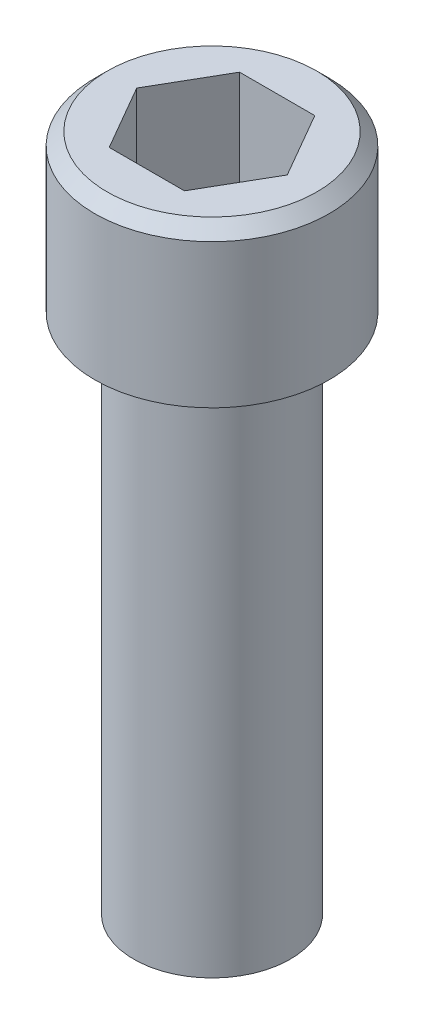
ISO-10303-21;
HEADER;
FILE_DESCRIPTION(('STEP AP214'),'2;1');
FILE_NAME('part.step','',(''),(''),'','','');
FILE_SCHEMA(('AUTOMOTIVE_DESIGN { 1 0 10303 214 1 1 1 1 }'));
ENDSEC;
DATA;
#1=APPLICATION_CONTEXT('core data for automotive mechanical design processes');
#2=APPLICATION_PROTOCOL_DEFINITION('international standard','automotive_design',2000,#1);
#3=PRODUCT_CONTEXT('',#1,'mechanical');
#4=PRODUCT('Part','Part','',(#3));
#5=PRODUCT_RELATED_PRODUCT_CATEGORY('part','',(#4));
#6=PRODUCT_DEFINITION_FORMATION('','',#4);
#7=PRODUCT_DEFINITION_CONTEXT('part definition',#1,'design');
#8=PRODUCT_DEFINITION('design','',#6,#7);
#9=PRODUCT_DEFINITION_SHAPE('','',#8);
#10=(LENGTH_UNIT() NAMED_UNIT(*) SI_UNIT(.MILLI.,.METRE.));
#11=(NAMED_UNIT(*) PLANE_ANGLE_UNIT() SI_UNIT($,.RADIAN.));
#12=(NAMED_UNIT(*) SI_UNIT($,.STERADIAN.) SOLID_ANGLE_UNIT());
#13=UNCERTAINTY_MEASURE_WITH_UNIT(LENGTH_MEASURE(1.E-05),#10,'distance_accuracy_value','');
#14=(GEOMETRIC_REPRESENTATION_CONTEXT(3) GLOBAL_UNCERTAINTY_ASSIGNED_CONTEXT((#13)) GLOBAL_UNIT_ASSIGNED_CONTEXT((#10,
#11,#12)) REPRESENTATION_CONTEXT('',''));
#15=CARTESIAN_POINT('',(0.,0.,0.));
#16=DIRECTION('',(0.,0.,1.));
#17=DIRECTION('',(1.,0.,0.));
#18=AXIS2_PLACEMENT_3D('',#15,#16,#17);
#19=CARTESIAN_POINT('',(0.,0.,0.));
#20=DIRECTION('',(0.,-1.,0.));
#21=DIRECTION('',(0.,0.,-1.));
#22=AXIS2_PLACEMENT_3D('',#19,#20,#21);
#23=CYLINDRICAL_SURFACE('',#22,7.14375);
#24=CARTESIAN_POINT('',(0.,8.76299999999999,0.));
#25=DIRECTION('',(0.,1.,0.));
#26=DIRECTION('',(0.,0.,1.));
#27=AXIS2_PLACEMENT_3D('',#24,#25,#26);
#28=CIRCLE('',#27,7.14375);
#29=CARTESIAN_POINT('',(0.,8.76299999999999,-7.14375));
#30=VERTEX_POINT('',#29);
#31=EDGE_CURVE('E42',#30,#30,#28,.F.);
#32=ORIENTED_EDGE('',*,*,#31,.T.);
#33=EDGE_LOOP('',(#32));
#34=FACE_BOUND('',#33,.T.);
#35=CARTESIAN_POINT('',(0.,0.,0.));
#36=DIRECTION('',(0.,-1.,0.));
#37=DIRECTION('',(0.,0.,-1.));
#38=AXIS2_PLACEMENT_3D('',#35,#36,#37);
#39=CIRCLE('',#38,7.14375);
#40=CARTESIAN_POINT('',(0.,0.,-7.14375));
#41=VERTEX_POINT('',#40);
#42=EDGE_CURVE('E137',#41,#41,#39,.T.);
#43=ORIENTED_EDGE('',*,*,#42,.F.);
#44=EDGE_LOOP('',(#43));
#45=FACE_BOUND('',#44,.T.);
#46=ADVANCED_FACE('F34',(#34,#45),#23,.T.);
#47=CARTESIAN_POINT('',(7.14375,9.525,0.));
#48=DIRECTION('',(0.,1.,0.));
#49=DIRECTION('',(0.,0.,1.));
#50=AXIS2_PLACEMENT_3D('',#47,#48,#49);
#51=PLANE('',#50);
#52=CARTESIAN_POINT('',(0.,9.525,0.));
#53=DIRECTION('',(0.,1.,0.));
#54=DIRECTION('',(0.,0.,1.));
#55=AXIS2_PLACEMENT_3D('',#52,#53,#54);
#56=CIRCLE('',#55,6.38174999999999);
#57=CARTESIAN_POINT('',(0.,9.525,-6.38174999999999));
#58=VERTEX_POINT('',#57);
#59=EDGE_CURVE('E11',#58,#58,#56,.T.);
#60=ORIENTED_EDGE('',*,*,#59,.T.);
#61=EDGE_LOOP('',(#60));
#62=FACE_BOUND('',#61,.T.);
#63=DIRECTION('',(1.,0.,0.));
#64=VECTOR('',#63,1.);
#65=CARTESIAN_POINT('',(-2.29135888084633,9.525,3.96875));
#66=LINE('',#65,#64);
#67=CARTESIAN_POINT('',(-2.29135888084633,9.525,3.96875));
#68=VERTEX_POINT('',#67);
#69=CARTESIAN_POINT('',(2.29135888084633,9.525,3.96875));
#70=VERTEX_POINT('',#69);
#71=EDGE_CURVE('E49',#68,#70,#66,.T.);
#72=ORIENTED_EDGE('',*,*,#71,.F.);
#73=DIRECTION('',(0.5,0.,0.866025403784439));
#74=VECTOR('',#73,1.);
#75=CARTESIAN_POINT('',(-4.58271776169265,9.525,0.));
#76=LINE('',#75,#74);
#77=CARTESIAN_POINT('',(-4.58271776169265,9.525,0.));
#78=VERTEX_POINT('',#77);
#79=EDGE_CURVE('E133',#78,#68,#76,.T.);
#80=ORIENTED_EDGE('',*,*,#79,.F.);
#81=DIRECTION('',(0.5,0.,-0.866025403784439));
#82=VECTOR('',#81,1.);
#83=CARTESIAN_POINT('',(-4.58271776169265,9.525,0.));
#84=LINE('',#83,#82);
#85=CARTESIAN_POINT('',(-2.29135888084633,9.525,-3.96875));
#86=VERTEX_POINT('',#85);
#87=EDGE_CURVE('E131',#78,#86,#84,.T.);
#88=ORIENTED_EDGE('',*,*,#87,.T.);
#89=DIRECTION('',(1.,0.,0.));
#90=VECTOR('',#89,1.);
#91=CARTESIAN_POINT('',(-2.29135888084633,9.525,-3.96875));
#92=LINE('',#91,#90);
#93=CARTESIAN_POINT('',(2.29135888084633,9.525,-3.96875));
#94=VERTEX_POINT('',#93);
#95=EDGE_CURVE('E108',#86,#94,#92,.T.);
#96=ORIENTED_EDGE('',*,*,#95,.T.);
#97=DIRECTION('',(-0.5,0.,-0.866025403784439));
#98=VECTOR('',#97,1.);
#99=CARTESIAN_POINT('',(4.58271776169265,9.525,0.));
#100=LINE('',#99,#98);
#101=CARTESIAN_POINT('',(4.58271776169265,9.525,0.));
#102=VERTEX_POINT('',#101);
#103=EDGE_CURVE('E127',#102,#94,#100,.T.);
#104=ORIENTED_EDGE('',*,*,#103,.F.);
#105=DIRECTION('',(-0.5,0.,0.866025403784439));
#106=VECTOR('',#105,1.);
#107=CARTESIAN_POINT('',(4.58271776169265,9.525,0.));
#108=LINE('',#107,#106);
#109=EDGE_CURVE('E124',#102,#70,#108,.T.);
#110=ORIENTED_EDGE('',*,*,#109,.T.);
#111=EDGE_LOOP('',(#72,#80,#88,#96,#104,#110));
#112=FACE_BOUND('',#111,.T.);
#113=ADVANCED_FACE('F164',(#62,#112),#51,.T.);
#114=CARTESIAN_POINT('',(0.,-31.75,0.));
#115=DIRECTION('',(0.,-1.,0.));
#116=DIRECTION('',(0.,0.,-1.));
#117=AXIS2_PLACEMENT_3D('',#114,#115,#116);
#118=PLANE('',#117);
#119=CARTESIAN_POINT('',(0.,-31.75,0.));
#120=DIRECTION('',(0.,-1.,0.));
#121=DIRECTION('',(0.,0.,-1.));
#122=AXIS2_PLACEMENT_3D('',#119,#120,#121);
#123=CIRCLE('',#122,4.7625);
#124=CARTESIAN_POINT('',(0.,-31.75,-4.7625));
#125=VERTEX_POINT('',#124);
#126=EDGE_CURVE('E148',#125,#125,#123,.T.);
#127=ORIENTED_EDGE('',*,*,#126,.T.);
#128=EDGE_LOOP('',(#127));
#129=FACE_BOUND('',#128,.T.);
#130=ADVANCED_FACE('F168',(#129),#118,.T.);
#131=CARTESIAN_POINT('',(0.,0.,0.));
#132=DIRECTION('',(0.,-1.,0.));
#133=DIRECTION('',(0.,0.,-1.));
#134=AXIS2_PLACEMENT_3D('',#131,#132,#133);
#135=CYLINDRICAL_SURFACE('',#134,4.7625);
#136=CARTESIAN_POINT('',(0.,0.,0.));
#137=DIRECTION('',(0.,-1.,0.));
#138=DIRECTION('',(0.,0.,-1.));
#139=AXIS2_PLACEMENT_3D('',#136,#137,#138);
#140=CIRCLE('',#139,4.7625);
#141=CARTESIAN_POINT('',(0.,0.,-4.7625));
#142=VERTEX_POINT('',#141);
#143=EDGE_CURVE('E145',#142,#142,#140,.T.);
#144=ORIENTED_EDGE('',*,*,#143,.T.);
#145=EDGE_LOOP('',(#144));
#146=FACE_BOUND('',#145,.T.);
#147=ORIENTED_EDGE('',*,*,#126,.F.);
#148=EDGE_LOOP('',(#147));
#149=FACE_BOUND('',#148,.T.);
#150=ADVANCED_FACE('F174',(#146,#149),#135,.T.);
#151=CARTESIAN_POINT('',(4.7625,0.,0.));
#152=DIRECTION('',(0.,-1.,0.));
#153=DIRECTION('',(0.,0.,-1.));
#154=AXIS2_PLACEMENT_3D('',#151,#152,#153);
#155=PLANE('',#154);
#156=ORIENTED_EDGE('',*,*,#42,.T.);
#157=EDGE_LOOP('',(#156));
#158=FACE_BOUND('',#157,.T.);
#159=ORIENTED_EDGE('',*,*,#143,.F.);
#160=EDGE_LOOP('',(#159));
#161=FACE_BOUND('',#160,.T.);
#162=ADVANCED_FACE('F178',(#158,#161),#155,.T.);
#163=CARTESIAN_POINT('',(-2.29135888084633,3.175,3.96875));
#164=DIRECTION('',(0.,0.,1.));
#165=DIRECTION('',(1.,0.,0.));
#166=AXIS2_PLACEMENT_3D('',#163,#164,#165);
#167=PLANE('',#166);
#168=ORIENTED_EDGE('',*,*,#71,.T.);
#169=DIRECTION('',(0.,1.,0.));
#170=VECTOR('',#169,1.);
#171=CARTESIAN_POINT('',(2.29135888084633,3.175,3.96875));
#172=LINE('',#171,#170);
#173=CARTESIAN_POINT('',(2.29135888084633,3.175,3.96875));
#174=VERTEX_POINT('',#173);
#175=EDGE_CURVE('E122',#174,#70,#172,.T.);
#176=ORIENTED_EDGE('',*,*,#175,.F.);
#177=DIRECTION('',(1.,0.,0.));
#178=VECTOR('',#177,1.);
#179=CARTESIAN_POINT('',(-2.29135888084633,3.175,3.96875));
#180=LINE('',#179,#178);
#181=CARTESIAN_POINT('',(-2.29135888084633,3.175,3.96875));
#182=VERTEX_POINT('',#181);
#183=EDGE_CURVE('E135',#182,#174,#180,.T.);
#184=ORIENTED_EDGE('',*,*,#183,.F.);
#185=DIRECTION('',(0.,1.,0.));
#186=VECTOR('',#185,1.);
#187=CARTESIAN_POINT('',(-2.29135888084633,3.175,3.96875));
#188=LINE('',#187,#186);
#189=EDGE_CURVE('E57',#182,#68,#188,.T.);
#190=ORIENTED_EDGE('',*,*,#189,.T.);
#191=EDGE_LOOP('',(#168,#176,#184,#190));
#192=FACE_BOUND('',#191,.T.);
#193=ADVANCED_FACE('F182',(#192),#167,.F.);
#194=CARTESIAN_POINT('',(-4.58271776169265,3.175,0.));
#195=DIRECTION('',(-0.866025403784439,0.,0.5));
#196=DIRECTION('',(0.5,0.,0.866025403784439));
#197=AXIS2_PLACEMENT_3D('',#194,#195,#196);
#198=PLANE('',#197);
#199=ORIENTED_EDGE('',*,*,#79,.T.);
#200=ORIENTED_EDGE('',*,*,#189,.F.);
#201=DIRECTION('',(0.5,0.,0.866025403784439));
#202=VECTOR('',#201,1.);
#203=CARTESIAN_POINT('',(-4.58271776169265,3.175,0.));
#204=LINE('',#203,#202);
#205=CARTESIAN_POINT('',(-4.58271776169265,3.175,0.));
#206=VERTEX_POINT('',#205);
#207=EDGE_CURVE('E101',#206,#182,#204,.T.);
#208=ORIENTED_EDGE('',*,*,#207,.F.);
#209=DIRECTION('',(0.,1.,0.));
#210=VECTOR('',#209,1.);
#211=CARTESIAN_POINT('',(-4.58271776169265,3.175,0.));
#212=LINE('',#211,#210);
#213=EDGE_CURVE('E97',#206,#78,#212,.T.);
#214=ORIENTED_EDGE('',*,*,#213,.T.);
#215=EDGE_LOOP('',(#199,#200,#208,#214));
#216=FACE_BOUND('',#215,.T.);
#217=ADVANCED_FACE('F186',(#216),#198,.F.);
#218=CARTESIAN_POINT('',(-4.58271776169265,3.175,0.));
#219=DIRECTION('',(0.866025403784439,0.,0.5));
#220=DIRECTION('',(0.5,0.,-0.866025403784439));
#221=AXIS2_PLACEMENT_3D('',#218,#219,#220);
#222=PLANE('',#221);
#223=ORIENTED_EDGE('',*,*,#87,.F.);
#224=ORIENTED_EDGE('',*,*,#213,.F.);
#225=DIRECTION('',(0.5,0.,-0.866025403784439));
#226=VECTOR('',#225,1.);
#227=CARTESIAN_POINT('',(-4.58271776169265,3.175,0.));
#228=LINE('',#227,#226);
#229=CARTESIAN_POINT('',(-2.29135888084633,3.175,-3.96875));
#230=VERTEX_POINT('',#229);
#231=EDGE_CURVE('E91',#206,#230,#228,.T.);
#232=ORIENTED_EDGE('',*,*,#231,.T.);
#233=DIRECTION('',(0.,1.,0.));
#234=VECTOR('',#233,1.);
#235=CARTESIAN_POINT('',(-2.29135888084633,3.175,-3.96875));
#236=LINE('',#235,#234);
#237=EDGE_CURVE('E95',#230,#86,#236,.T.);
#238=ORIENTED_EDGE('',*,*,#237,.T.);
#239=EDGE_LOOP('',(#223,#224,#232,#238));
#240=FACE_BOUND('',#239,.T.);
#241=ADVANCED_FACE('F94',(#240),#222,.T.);
#242=CARTESIAN_POINT('',(-2.29135888084633,3.175,-3.96875));
#243=DIRECTION('',(0.,0.,1.));
#244=DIRECTION('',(1.,0.,0.));
#245=AXIS2_PLACEMENT_3D('',#242,#243,#244);
#246=PLANE('',#245);
#247=ORIENTED_EDGE('',*,*,#95,.F.);
#248=ORIENTED_EDGE('',*,*,#237,.F.);
#249=DIRECTION('',(1.,0.,0.));
#250=VECTOR('',#249,1.);
#251=CARTESIAN_POINT('',(-2.29135888084633,3.175,-3.96875));
#252=LINE('',#251,#250);
#253=CARTESIAN_POINT('',(2.29135888084633,3.175,-3.96875));
#254=VERTEX_POINT('',#253);
#255=EDGE_CURVE('E102',#230,#254,#252,.T.);
#256=ORIENTED_EDGE('',*,*,#255,.T.);
#257=DIRECTION('',(0.,1.,0.));
#258=VECTOR('',#257,1.);
#259=CARTESIAN_POINT('',(2.29135888084633,3.175,-3.96875));
#260=LINE('',#259,#258);
#261=EDGE_CURVE('E110',#254,#94,#260,.T.);
#262=ORIENTED_EDGE('',*,*,#261,.T.);
#263=EDGE_LOOP('',(#247,#248,#256,#262));
#264=FACE_BOUND('',#263,.T.);
#265=ADVANCED_FACE('F105',(#264),#246,.T.);
#266=CARTESIAN_POINT('',(4.58271776169265,3.175,0.));
#267=DIRECTION('',(0.866025403784439,0.,-0.5));
#268=DIRECTION('',(-0.5,0.,-0.866025403784439));
#269=AXIS2_PLACEMENT_3D('',#266,#267,#268);
#270=PLANE('',#269);
#271=ORIENTED_EDGE('',*,*,#103,.T.);
#272=ORIENTED_EDGE('',*,*,#261,.F.);
#273=DIRECTION('',(-0.5,0.,-0.866025403784439));
#274=VECTOR('',#273,1.);
#275=CARTESIAN_POINT('',(4.58271776169265,3.175,0.));
#276=LINE('',#275,#274);
#277=CARTESIAN_POINT('',(4.58271776169265,3.175,0.));
#278=VERTEX_POINT('',#277);
#279=EDGE_CURVE('E116',#278,#254,#276,.T.);
#280=ORIENTED_EDGE('',*,*,#279,.F.);
#281=DIRECTION('',(0.,1.,0.));
#282=VECTOR('',#281,1.);
#283=CARTESIAN_POINT('',(4.58271776169265,3.175,0.));
#284=LINE('',#283,#282);
#285=EDGE_CURVE('E140',#278,#102,#284,.T.);
#286=ORIENTED_EDGE('',*,*,#285,.T.);
#287=EDGE_LOOP('',(#271,#272,#280,#286));
#288=FACE_BOUND('',#287,.T.);
#289=ADVANCED_FACE('F189',(#288),#270,.F.);
#290=CARTESIAN_POINT('',(4.58271776169265,3.175,0.));
#291=DIRECTION('',(-0.866025403784439,0.,-0.5));
#292=DIRECTION('',(-0.5,0.,0.866025403784439));
#293=AXIS2_PLACEMENT_3D('',#290,#291,#292);
#294=PLANE('',#293);
#295=ORIENTED_EDGE('',*,*,#109,.F.);
#296=ORIENTED_EDGE('',*,*,#285,.F.);
#297=DIRECTION('',(-0.5,0.,0.866025403784439));
#298=VECTOR('',#297,1.);
#299=CARTESIAN_POINT('',(4.58271776169265,3.175,0.));
#300=LINE('',#299,#298);
#301=EDGE_CURVE('E83',#278,#174,#300,.T.);
#302=ORIENTED_EDGE('',*,*,#301,.T.);
#303=ORIENTED_EDGE('',*,*,#175,.T.);
#304=EDGE_LOOP('',(#295,#296,#302,#303));
#305=FACE_BOUND('',#304,.T.);
#306=ADVANCED_FACE('F160',(#305),#294,.T.);
#307=CARTESIAN_POINT('',(2.29135888084633,3.175,3.96875));
#308=DIRECTION('',(0.,-1.,0.));
#309=DIRECTION('',(0.,0.,-1.));
#310=AXIS2_PLACEMENT_3D('',#307,#308,#309);
#311=PLANE('',#310);
#312=ORIENTED_EDGE('',*,*,#183,.T.);
#313=ORIENTED_EDGE('',*,*,#301,.F.);
#314=ORIENTED_EDGE('',*,*,#279,.T.);
#315=ORIENTED_EDGE('',*,*,#255,.F.);
#316=ORIENTED_EDGE('',*,*,#231,.F.);
#317=ORIENTED_EDGE('',*,*,#207,.T.);
#318=EDGE_LOOP('',(#312,#313,#314,#315,#316,#317));
#319=FACE_BOUND('',#318,.T.);
#320=ADVANCED_FACE('F114',(#319),#311,.F.);
#321=CARTESIAN_POINT('',(0.,8.76299999999999,0.));
#322=DIRECTION('',(0.,-1.,0.));
#323=DIRECTION('',(0.,0.,-1.));
#324=AXIS2_PLACEMENT_3D('',#321,#322,#323);
#325=CONICAL_SURFACE('',#324,7.14375,0.785398163397444);
#326=CARTESIAN_POINT('',(0.,9.525,-6.38174999999999));
#327=CARTESIAN_POINT('',(0.,9.5170625,-6.3896875));
#328=CARTESIAN_POINT('',(0.,9.509125,-6.397625));
#329=CARTESIAN_POINT('',(0.,9.49325,-6.41349999999999));
#330=CARTESIAN_POINT('',(0.,9.4853125,-6.42143749999999));
#331=CARTESIAN_POINT('',(0.,9.4694375,-6.43731249999999));
#332=CARTESIAN_POINT('',(0.,9.4615,-6.44524999999999));
#333=CARTESIAN_POINT('',(0.,9.445625,-6.46112499999999));
#334=CARTESIAN_POINT('',(0.,9.4376875,-6.46906249999999));
#335=CARTESIAN_POINT('',(0.,9.4218125,-6.48493749999999));
#336=CARTESIAN_POINT('',(0.,9.413875,-6.492875));
#337=CARTESIAN_POINT('',(0.,9.398,-6.50875));
#338=CARTESIAN_POINT('',(0.,9.3900625,-6.5166875));
#339=CARTESIAN_POINT('',(0.,9.3741875,-6.5325625));
#340=CARTESIAN_POINT('',(0.,9.36625,-6.5405));
#341=CARTESIAN_POINT('',(0.,9.350375,-6.556375));
#342=CARTESIAN_POINT('',(0.,9.3424375,-6.5643125));
#343=CARTESIAN_POINT('',(0.,9.3265625,-6.5801875));
#344=CARTESIAN_POINT('',(0.,9.318625,-6.588125));
#345=CARTESIAN_POINT('',(0.,9.30275,-6.604));
#346=CARTESIAN_POINT('',(0.,9.2948125,-6.6119375));
#347=CARTESIAN_POINT('',(0.,9.2789375,-6.6278125));
#348=CARTESIAN_POINT('',(0.,9.271,-6.63575));
#349=CARTESIAN_POINT('',(0.,9.255125,-6.651625));
#350=CARTESIAN_POINT('',(0.,9.2471875,-6.6595625));
#351=CARTESIAN_POINT('',(0.,9.2313125,-6.6754375));
#352=CARTESIAN_POINT('',(0.,9.223375,-6.683375));
#353=CARTESIAN_POINT('',(0.,9.2075,-6.69925));
#354=CARTESIAN_POINT('',(0.,9.1995625,-6.7071875));
#355=CARTESIAN_POINT('',(0.,9.1836875,-6.7230625));
#356=CARTESIAN_POINT('',(0.,9.17575,-6.731));
#357=CARTESIAN_POINT('',(0.,9.15987499999999,-6.746875));
#358=CARTESIAN_POINT('',(0.,9.1519375,-6.7548125));
#359=CARTESIAN_POINT('',(0.,9.13606249999999,-6.7706875));
#360=CARTESIAN_POINT('',(0.,9.12812499999999,-6.778625));
#361=CARTESIAN_POINT('',(0.,9.11224999999999,-6.7945));
#362=CARTESIAN_POINT('',(0.,9.10431249999999,-6.8024375));
#363=CARTESIAN_POINT('',(0.,9.08843749999999,-6.8183125));
#364=CARTESIAN_POINT('',(0.,9.08049999999999,-6.82625));
#365=CARTESIAN_POINT('',(0.,9.06462499999999,-6.842125));
#366=CARTESIAN_POINT('',(0.,9.05668749999999,-6.8500625));
#367=CARTESIAN_POINT('',(0.,9.04081249999999,-6.8659375));
#368=CARTESIAN_POINT('',(0.,9.03287499999999,-6.873875));
#369=CARTESIAN_POINT('',(0.,9.01699999999999,-6.88975));
#370=CARTESIAN_POINT('',(0.,9.00906249999999,-6.8976875));
#371=CARTESIAN_POINT('',(0.,8.99318749999999,-6.9135625));
#372=CARTESIAN_POINT('',(0.,8.98524999999999,-6.9215));
#373=CARTESIAN_POINT('',(0.,8.96937499999999,-6.937375));
#374=CARTESIAN_POINT('',(0.,8.96143749999999,-6.9453125));
#375=CARTESIAN_POINT('',(0.,8.94556249999999,-6.9611875));
#376=CARTESIAN_POINT('',(0.,8.93762499999999,-6.969125));
#377=CARTESIAN_POINT('',(0.,8.92174999999999,-6.985));
#378=CARTESIAN_POINT('',(0.,8.91381249999999,-6.9929375));
#379=CARTESIAN_POINT('',(0.,8.89793749999999,-7.0088125));
#380=CARTESIAN_POINT('',(0.,8.88999999999999,-7.01675));
#381=CARTESIAN_POINT('',(0.,8.87412499999999,-7.032625));
#382=CARTESIAN_POINT('',(0.,8.86618749999999,-7.0405625));
#383=CARTESIAN_POINT('',(0.,8.85031249999999,-7.0564375));
#384=CARTESIAN_POINT('',(0.,8.84237499999999,-7.064375));
#385=CARTESIAN_POINT('',(0.,8.82649999999999,-7.08025));
#386=CARTESIAN_POINT('',(0.,8.81856249999999,-7.0881875));
#387=CARTESIAN_POINT('',(0.,8.80268749999999,-7.1040625));
#388=CARTESIAN_POINT('',(0.,8.79474999999999,-7.112));
#389=CARTESIAN_POINT('',(0.,8.77887499999999,-7.127875));
#390=CARTESIAN_POINT('',(0.,8.77093749999999,-7.1358125));
#391=CARTESIAN_POINT('',(0.,8.76299999999999,-7.14375));
#392=B_SPLINE_CURVE_WITH_KNOTS('',3,(#326,#327,#328,#329,#330,#331,#332,#333,#334,#335,#336,
#337,#338,#339,#340,#341,#342,#343,#344,#345,#346,#347,#348,#349,#350,#351,#352,#353,#354,#355,
#356,#357,#358,#359,#360,#361,#362,#363,#364,#365,#366,#367,#368,#369,#370,#371,#372,#373,#374,
#375,#376,#377,#378,#379,#380,#381,#382,#383,#384,#385,#386,#387,#388,#389,#390,#391),
.UNSPECIFIED.,.F.,.F.,(4,2,2,2,2,2,2,2,2,2,2,2,2,2,2,2,2,2,2,2,2,2,2,2,2,2,2,2,2,2,2,2,4),(0.,
0.0336759604540093,0.0673519209080192,0.101027881362028,0.134703841816039,0.168379802270048,
0.202055762724059,0.235731723178067,0.269407683632078,0.303083644086087,0.336759604540097,
0.370435564994106,0.404111525448117,0.437787485902126,0.471463446356137,0.505139406810145,
0.538815367264156,0.572491327718165,0.606167288172175,0.639843248626184,0.673519209080195,
0.707195169534204,0.740871129988214,0.774547090442223,0.808223050896234,0.841899011350243,
0.875574971804253,0.909250932258262,0.942926892712272,0.976602853166282,1.01027881362029,
1.0439547740743,1.07763073452831),.UNSPECIFIED.);
#393=EDGE_CURVE('BSEAM36',#58,#30,#392,.T.);
#394=ORIENTED_EDGE('',*,*,#59,.F.);
#395=ORIENTED_EDGE('',*,*,#31,.F.);
#396=ORIENTED_EDGE('',*,*,#393,.T.);
#397=ORIENTED_EDGE('',*,*,#393,.F.);
#398=EDGE_LOOP('',(#394,#396,#395,#397));
#399=FACE_BOUND('',#398,.T.);
#400=ADVANCED_FACE('F36',(#399),#325,.T.);
#401=CLOSED_SHELL('',(#46,#113,#130,#150,#162,#193,#217,#241,#265,#289,#306,#320,#400));
#402=MANIFOLD_SOLID_BREP('B2',#401);
#403=ADVANCED_BREP_SHAPE_REPRESENTATION('',(#18,#402),#14);
#404=SHAPE_DEFINITION_REPRESENTATION(#9,#403);
ENDSEC;
END-ISO-10303-21;
